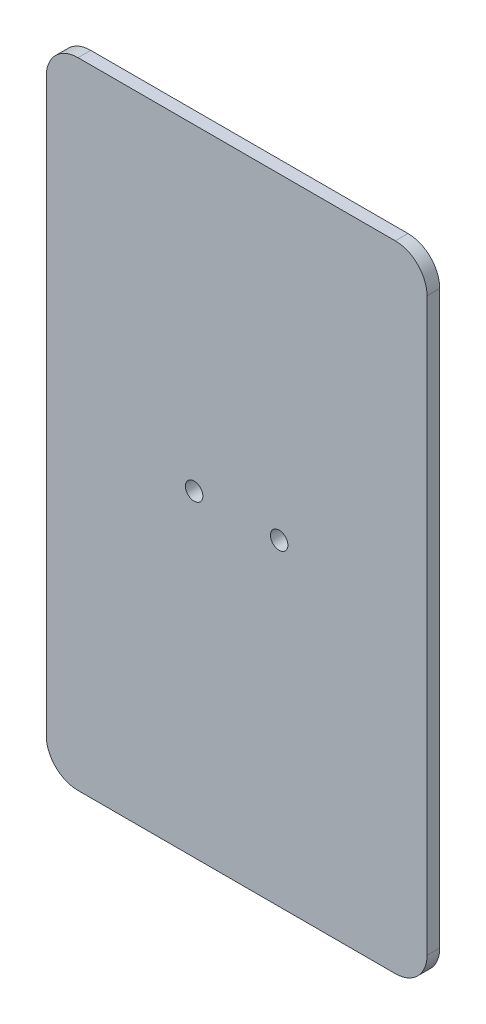
ISO-10303-21;
HEADER;
FILE_DESCRIPTION(('STEP AP214'),'2;1');
FILE_NAME('part.step','',(''),(''),'','','');
FILE_SCHEMA(('AUTOMOTIVE_DESIGN { 1 0 10303 214 1 1 1 1 }'));
ENDSEC;
DATA;
#1=APPLICATION_CONTEXT('core data for automotive mechanical design processes');
#2=APPLICATION_PROTOCOL_DEFINITION('international standard','automotive_design',2000,#1);
#3=PRODUCT_CONTEXT('',#1,'mechanical');
#4=PRODUCT('Part','Part','',(#3));
#5=PRODUCT_RELATED_PRODUCT_CATEGORY('part','',(#4));
#6=PRODUCT_DEFINITION_FORMATION('','',#4);
#7=PRODUCT_DEFINITION_CONTEXT('part definition',#1,'design');
#8=PRODUCT_DEFINITION('design','',#6,#7);
#9=PRODUCT_DEFINITION_SHAPE('','',#8);
#10=(LENGTH_UNIT() NAMED_UNIT(*) SI_UNIT(.MILLI.,.METRE.));
#11=(NAMED_UNIT(*) PLANE_ANGLE_UNIT() SI_UNIT($,.RADIAN.));
#12=(NAMED_UNIT(*) SI_UNIT($,.STERADIAN.) SOLID_ANGLE_UNIT());
#13=UNCERTAINTY_MEASURE_WITH_UNIT(LENGTH_MEASURE(1.E-05),#10,'distance_accuracy_value','');
#14=(GEOMETRIC_REPRESENTATION_CONTEXT(3) GLOBAL_UNCERTAINTY_ASSIGNED_CONTEXT((#13)) GLOBAL_UNIT_ASSIGNED_CONTEXT((#10,
#11,#12)) REPRESENTATION_CONTEXT('',''));
#15=CARTESIAN_POINT('',(0.,0.,0.));
#16=DIRECTION('',(0.,0.,1.));
#17=DIRECTION('',(1.,0.,0.));
#18=AXIS2_PLACEMENT_3D('',#15,#16,#17);
#19=CARTESIAN_POINT('',(6.35,6.35,2.54));
#20=DIRECTION('',(0.,0.,-1.));
#21=DIRECTION('',(-1.,0.,0.));
#22=AXIS2_PLACEMENT_3D('',#19,#20,#21);
#23=PLANE('',#22);
#24=CARTESIAN_POINT('',(6.35,6.35,2.54));
#25=DIRECTION('',(0.,0.,1.));
#26=DIRECTION('',(-1.,0.,0.));
#27=AXIS2_PLACEMENT_3D('',#24,#25,#26);
#28=CIRCLE('',#27,6.35);
#29=CARTESIAN_POINT('',(0.,6.35000000000004,2.54));
#30=VERTEX_POINT('',#29);
#31=CARTESIAN_POINT('',(6.35000000000004,0.,2.54));
#32=VERTEX_POINT('',#31);
#33=EDGE_CURVE('E145',#30,#32,#28,.T.);
#34=ORIENTED_EDGE('',*,*,#33,.T.);
#35=DIRECTION('',(1.,0.,0.));
#36=VECTOR('',#35,1.);
#37=CARTESIAN_POINT('',(6.35000000000004,0.,2.54));
#38=LINE('',#37,#36);
#39=CARTESIAN_POINT('',(69.85,0.,2.54));
#40=VERTEX_POINT('',#39);
#41=EDGE_CURVE('E93',#32,#40,#38,.T.);
#42=ORIENTED_EDGE('',*,*,#41,.T.);
#43=CARTESIAN_POINT('',(69.85,6.35,2.54));
#44=DIRECTION('',(0.,0.,1.));
#45=DIRECTION('',(1.,0.,0.));
#46=AXIS2_PLACEMENT_3D('',#43,#44,#45);
#47=CIRCLE('',#46,6.35);
#48=CARTESIAN_POINT('',(76.2,6.35,2.54));
#49=VERTEX_POINT('',#48);
#50=EDGE_CURVE('E160',#40,#49,#47,.T.);
#51=ORIENTED_EDGE('',*,*,#50,.T.);
#52=DIRECTION('',(0.,1.,0.));
#53=VECTOR('',#52,1.);
#54=CARTESIAN_POINT('',(76.2,6.35000000000004,2.54));
#55=LINE('',#54,#53);
#56=CARTESIAN_POINT('',(76.2,120.65,2.54));
#57=VERTEX_POINT('',#56);
#58=EDGE_CURVE('E173',#49,#57,#55,.T.);
#59=ORIENTED_EDGE('',*,*,#58,.T.);
#60=CARTESIAN_POINT('',(69.85,120.65,2.54));
#61=DIRECTION('',(0.,0.,1.));
#62=DIRECTION('',(-1.,0.,0.));
#63=AXIS2_PLACEMENT_3D('',#60,#61,#62);
#64=CIRCLE('',#63,6.34999999999999);
#65=CARTESIAN_POINT('',(69.85,127.,2.54));
#66=VERTEX_POINT('',#65);
#67=EDGE_CURVE('E112',#57,#66,#64,.T.);
#68=ORIENTED_EDGE('',*,*,#67,.T.);
#69=DIRECTION('',(-1.,0.,0.));
#70=VECTOR('',#69,1.);
#71=CARTESIAN_POINT('',(6.35000000000004,127.,2.54));
#72=LINE('',#71,#70);
#73=CARTESIAN_POINT('',(6.35000000000004,127.,2.54));
#74=VERTEX_POINT('',#73);
#75=EDGE_CURVE('E106',#66,#74,#72,.T.);
#76=ORIENTED_EDGE('',*,*,#75,.T.);
#77=CARTESIAN_POINT('',(6.35,120.65,2.54));
#78=DIRECTION('',(0.,0.,1.));
#79=DIRECTION('',(-1.,0.,0.));
#80=AXIS2_PLACEMENT_3D('',#77,#78,#79);
#81=CIRCLE('',#80,6.35);
#82=CARTESIAN_POINT('',(0.,120.65,2.54));
#83=VERTEX_POINT('',#82);
#84=EDGE_CURVE('E110',#74,#83,#81,.T.);
#85=ORIENTED_EDGE('',*,*,#84,.T.);
#86=DIRECTION('',(0.,-1.,0.));
#87=VECTOR('',#86,1.);
#88=CARTESIAN_POINT('',(0.,6.35000000000004,2.54));
#89=LINE('',#88,#87);
#90=EDGE_CURVE('E50',#83,#30,#89,.T.);
#91=ORIENTED_EDGE('',*,*,#90,.T.);
#92=EDGE_LOOP('',(#34,#42,#51,#59,#68,#76,#85,#91));
#93=FACE_BOUND('',#92,.T.);
#94=CARTESIAN_POINT('',(29.591,63.5,2.54));
#95=DIRECTION('',(0.,0.,1.));
#96=DIRECTION('',(1.,0.,0.));
#97=AXIS2_PLACEMENT_3D('',#94,#95,#96);
#98=CIRCLE('',#97,1.74624999999999);
#99=CARTESIAN_POINT('',(31.33725,63.5,2.54));
#100=VERTEX_POINT('',#99);
#101=EDGE_CURVE('E134',#100,#100,#98,.T.);
#102=ORIENTED_EDGE('',*,*,#101,.F.);
#103=EDGE_LOOP('',(#102));
#104=FACE_BOUND('',#103,.T.);
#105=CARTESIAN_POINT('',(46.609,63.5,2.54));
#106=DIRECTION('',(0.,0.,1.));
#107=DIRECTION('',(1.,0.,0.));
#108=AXIS2_PLACEMENT_3D('',#105,#106,#107);
#109=CIRCLE('',#108,1.74624999999999);
#110=CARTESIAN_POINT('',(48.35525,63.5,2.54));
#111=VERTEX_POINT('',#110);
#112=EDGE_CURVE('E182',#111,#111,#109,.T.);
#113=ORIENTED_EDGE('',*,*,#112,.F.);
#114=EDGE_LOOP('',(#113));
#115=FACE_BOUND('',#114,.T.);
#116=ADVANCED_FACE('F33',(#93,#104,#115),#23,.F.);
#117=CARTESIAN_POINT('',(6.35,6.35,0.));
#118=DIRECTION('',(0.,0.,-1.));
#119=DIRECTION('',(-1.,0.,0.));
#120=AXIS2_PLACEMENT_3D('',#117,#118,#119);
#121=PLANE('',#120);
#122=CARTESIAN_POINT('',(29.591,63.5,0.));
#123=DIRECTION('',(0.,0.,1.));
#124=DIRECTION('',(1.,0.,0.));
#125=AXIS2_PLACEMENT_3D('',#122,#123,#124);
#126=CIRCLE('',#125,1.74624999999999);
#127=CARTESIAN_POINT('',(31.33725,63.5,0.));
#128=VERTEX_POINT('',#127);
#129=EDGE_CURVE('E179',#128,#128,#126,.T.);
#130=ORIENTED_EDGE('',*,*,#129,.T.);
#131=EDGE_LOOP('',(#130));
#132=FACE_BOUND('',#131,.T.);
#133=CARTESIAN_POINT('',(6.35,6.35,0.));
#134=DIRECTION('',(0.,0.,1.));
#135=DIRECTION('',(-1.,0.,0.));
#136=AXIS2_PLACEMENT_3D('',#133,#134,#135);
#137=CIRCLE('',#136,6.35);
#138=CARTESIAN_POINT('',(0.,6.35000000000004,0.));
#139=VERTEX_POINT('',#138);
#140=CARTESIAN_POINT('',(6.35000000000004,0.,0.));
#141=VERTEX_POINT('',#140);
#142=EDGE_CURVE('E130',#139,#141,#137,.T.);
#143=ORIENTED_EDGE('',*,*,#142,.F.);
#144=DIRECTION('',(0.,-1.,0.));
#145=VECTOR('',#144,1.);
#146=CARTESIAN_POINT('',(0.,6.35000000000004,0.));
#147=LINE('',#146,#145);
#148=CARTESIAN_POINT('',(0.,120.65,0.));
#149=VERTEX_POINT('',#148);
#150=EDGE_CURVE('E85',#149,#139,#147,.T.);
#151=ORIENTED_EDGE('',*,*,#150,.F.);
#152=CARTESIAN_POINT('',(6.35,120.65,0.));
#153=DIRECTION('',(0.,0.,1.));
#154=DIRECTION('',(-1.,0.,0.));
#155=AXIS2_PLACEMENT_3D('',#152,#153,#154);
#156=CIRCLE('',#155,6.35);
#157=CARTESIAN_POINT('',(6.35000000000004,127.,0.));
#158=VERTEX_POINT('',#157);
#159=EDGE_CURVE('E79',#158,#149,#156,.T.);
#160=ORIENTED_EDGE('',*,*,#159,.F.);
#161=DIRECTION('',(-1.,0.,0.));
#162=VECTOR('',#161,1.);
#163=CARTESIAN_POINT('',(6.35000000000004,127.,0.));
#164=LINE('',#163,#162);
#165=CARTESIAN_POINT('',(69.85,127.,0.));
#166=VERTEX_POINT('',#165);
#167=EDGE_CURVE('E120',#166,#158,#164,.T.);
#168=ORIENTED_EDGE('',*,*,#167,.F.);
#169=CARTESIAN_POINT('',(69.85,120.65,0.));
#170=DIRECTION('',(0.,0.,1.));
#171=DIRECTION('',(-1.,0.,0.));
#172=AXIS2_PLACEMENT_3D('',#169,#170,#171);
#173=CIRCLE('',#172,6.34999999999999);
#174=CARTESIAN_POINT('',(76.2,120.65,0.));
#175=VERTEX_POINT('',#174);
#176=EDGE_CURVE('E140',#175,#166,#173,.T.);
#177=ORIENTED_EDGE('',*,*,#176,.F.);
#178=DIRECTION('',(0.,1.,0.));
#179=VECTOR('',#178,1.);
#180=CARTESIAN_POINT('',(76.2,6.35000000000004,0.));
#181=LINE('',#180,#179);
#182=CARTESIAN_POINT('',(76.2,6.35,0.));
#183=VERTEX_POINT('',#182);
#184=EDGE_CURVE('E138',#183,#175,#181,.T.);
#185=ORIENTED_EDGE('',*,*,#184,.F.);
#186=CARTESIAN_POINT('',(69.85,6.35,0.));
#187=DIRECTION('',(0.,0.,1.));
#188=DIRECTION('',(1.,0.,0.));
#189=AXIS2_PLACEMENT_3D('',#186,#187,#188);
#190=CIRCLE('',#189,6.35);
#191=CARTESIAN_POINT('',(69.85,0.,0.));
#192=VERTEX_POINT('',#191);
#193=EDGE_CURVE('E136',#192,#183,#190,.T.);
#194=ORIENTED_EDGE('',*,*,#193,.F.);
#195=DIRECTION('',(1.,0.,0.));
#196=VECTOR('',#195,1.);
#197=CARTESIAN_POINT('',(6.35000000000004,0.,0.));
#198=LINE('',#197,#196);
#199=EDGE_CURVE('E133',#141,#192,#198,.T.);
#200=ORIENTED_EDGE('',*,*,#199,.F.);
#201=EDGE_LOOP('',(#143,#151,#160,#168,#177,#185,#194,#200));
#202=FACE_BOUND('',#201,.T.);
#203=CARTESIAN_POINT('',(46.609,63.5,0.));
#204=DIRECTION('',(0.,0.,1.));
#205=DIRECTION('',(1.,0.,0.));
#206=AXIS2_PLACEMENT_3D('',#203,#204,#205);
#207=CIRCLE('',#206,1.74624999999999);
#208=CARTESIAN_POINT('',(48.35525,63.5,0.));
#209=VERTEX_POINT('',#208);
#210=EDGE_CURVE('E185',#209,#209,#207,.T.);
#211=ORIENTED_EDGE('',*,*,#210,.T.);
#212=EDGE_LOOP('',(#211));
#213=FACE_BOUND('',#212,.T.);
#214=ADVANCED_FACE('F164',(#132,#202,#213),#121,.T.);
#215=CARTESIAN_POINT('',(6.35,6.35,2.54));
#216=DIRECTION('',(0.,0.,-1.));
#217=DIRECTION('',(-1.,0.,0.));
#218=AXIS2_PLACEMENT_3D('',#215,#216,#217);
#219=CYLINDRICAL_SURFACE('',#218,6.35);
#220=ORIENTED_EDGE('',*,*,#142,.T.);
#221=DIRECTION('',(0.,0.,-1.));
#222=VECTOR('',#221,1.);
#223=CARTESIAN_POINT('',(6.35000000000004,0.,2.54));
#224=LINE('',#223,#222);
#225=EDGE_CURVE('E11',#32,#141,#224,.T.);
#226=ORIENTED_EDGE('',*,*,#225,.F.);
#227=ORIENTED_EDGE('',*,*,#33,.F.);
#228=DIRECTION('',(0.,0.,-1.));
#229=VECTOR('',#228,1.);
#230=CARTESIAN_POINT('',(0.,6.35000000000004,2.54));
#231=LINE('',#230,#229);
#232=EDGE_CURVE('E126',#30,#139,#231,.T.);
#233=ORIENTED_EDGE('',*,*,#232,.T.);
#234=EDGE_LOOP('',(#220,#226,#227,#233));
#235=FACE_BOUND('',#234,.T.);
#236=ADVANCED_FACE('F35',(#235),#219,.T.);
#237=CARTESIAN_POINT('',(6.35000000000004,0.,2.54));
#238=DIRECTION('',(0.,1.,0.));
#239=DIRECTION('',(0.,0.,1.));
#240=AXIS2_PLACEMENT_3D('',#237,#238,#239);
#241=PLANE('',#240);
#242=ORIENTED_EDGE('',*,*,#199,.T.);
#243=DIRECTION('',(0.,0.,-1.));
#244=VECTOR('',#243,1.);
#245=CARTESIAN_POINT('',(69.85,0.,2.54));
#246=LINE('',#245,#244);
#247=EDGE_CURVE('E42',#40,#192,#246,.T.);
#248=ORIENTED_EDGE('',*,*,#247,.F.);
#249=ORIENTED_EDGE('',*,*,#41,.F.);
#250=ORIENTED_EDGE('',*,*,#225,.T.);
#251=EDGE_LOOP('',(#242,#248,#249,#250));
#252=FACE_BOUND('',#251,.T.);
#253=ADVANCED_FACE('F217',(#252),#241,.F.);
#254=CARTESIAN_POINT('',(69.85,6.35,2.54));
#255=DIRECTION('',(0.,0.,-1.));
#256=DIRECTION('',(-1.,0.,0.));
#257=AXIS2_PLACEMENT_3D('',#254,#255,#256);
#258=CYLINDRICAL_SURFACE('',#257,6.35);
#259=ORIENTED_EDGE('',*,*,#193,.T.);
#260=DIRECTION('',(0.,0.,-1.));
#261=VECTOR('',#260,1.);
#262=CARTESIAN_POINT('',(76.2,6.35,2.54));
#263=LINE('',#262,#261);
#264=EDGE_CURVE('E152',#49,#183,#263,.T.);
#265=ORIENTED_EDGE('',*,*,#264,.F.);
#266=ORIENTED_EDGE('',*,*,#50,.F.);
#267=ORIENTED_EDGE('',*,*,#247,.T.);
#268=EDGE_LOOP('',(#259,#265,#266,#267));
#269=FACE_BOUND('',#268,.T.);
#270=ADVANCED_FACE('F158',(#269),#258,.T.);
#271=CARTESIAN_POINT('',(76.2,6.35000000000004,2.54));
#272=DIRECTION('',(-1.,0.,0.));
#273=DIRECTION('',(0.,0.,1.));
#274=AXIS2_PLACEMENT_3D('',#271,#272,#273);
#275=PLANE('',#274);
#276=ORIENTED_EDGE('',*,*,#184,.T.);
#277=DIRECTION('',(0.,0.,-1.));
#278=VECTOR('',#277,1.);
#279=CARTESIAN_POINT('',(76.2,120.65,2.54));
#280=LINE('',#279,#278);
#281=EDGE_CURVE('E149',#57,#175,#280,.T.);
#282=ORIENTED_EDGE('',*,*,#281,.F.);
#283=ORIENTED_EDGE('',*,*,#58,.F.);
#284=ORIENTED_EDGE('',*,*,#264,.T.);
#285=EDGE_LOOP('',(#276,#282,#283,#284));
#286=FACE_BOUND('',#285,.T.);
#287=ADVANCED_FACE('F169',(#286),#275,.F.);
#288=CARTESIAN_POINT('',(69.85,120.65,2.54));
#289=DIRECTION('',(0.,0.,-1.));
#290=DIRECTION('',(-1.,0.,0.));
#291=AXIS2_PLACEMENT_3D('',#288,#289,#290);
#292=CYLINDRICAL_SURFACE('',#291,6.34999999999999);
#293=ORIENTED_EDGE('',*,*,#176,.T.);
#294=DIRECTION('',(0.,0.,-1.));
#295=VECTOR('',#294,1.);
#296=CARTESIAN_POINT('',(69.85,127.,2.54));
#297=LINE('',#296,#295);
#298=EDGE_CURVE('E121',#66,#166,#297,.T.);
#299=ORIENTED_EDGE('',*,*,#298,.F.);
#300=ORIENTED_EDGE('',*,*,#67,.F.);
#301=ORIENTED_EDGE('',*,*,#281,.T.);
#302=EDGE_LOOP('',(#293,#299,#300,#301));
#303=FACE_BOUND('',#302,.T.);
#304=ADVANCED_FACE('F172',(#303),#292,.T.);
#305=CARTESIAN_POINT('',(6.35000000000004,127.,2.54));
#306=DIRECTION('',(0.,-1.,0.));
#307=DIRECTION('',(0.,0.,-1.));
#308=AXIS2_PLACEMENT_3D('',#305,#306,#307);
#309=PLANE('',#308);
#310=ORIENTED_EDGE('',*,*,#167,.T.);
#311=DIRECTION('',(0.,0.,-1.));
#312=VECTOR('',#311,1.);
#313=CARTESIAN_POINT('',(6.35000000000004,127.,2.54));
#314=LINE('',#313,#312);
#315=EDGE_CURVE('E117',#74,#158,#314,.T.);
#316=ORIENTED_EDGE('',*,*,#315,.F.);
#317=ORIENTED_EDGE('',*,*,#75,.F.);
#318=ORIENTED_EDGE('',*,*,#298,.T.);
#319=EDGE_LOOP('',(#310,#316,#317,#318));
#320=FACE_BOUND('',#319,.T.);
#321=ADVANCED_FACE('F118',(#320),#309,.F.);
#322=CARTESIAN_POINT('',(6.35,120.65,2.54));
#323=DIRECTION('',(0.,0.,-1.));
#324=DIRECTION('',(-1.,0.,0.));
#325=AXIS2_PLACEMENT_3D('',#322,#323,#324);
#326=CYLINDRICAL_SURFACE('',#325,6.35);
#327=ORIENTED_EDGE('',*,*,#159,.T.);
#328=DIRECTION('',(0.,0.,-1.));
#329=VECTOR('',#328,1.);
#330=CARTESIAN_POINT('',(0.,120.65,2.54));
#331=LINE('',#330,#329);
#332=EDGE_CURVE('E122',#83,#149,#331,.T.);
#333=ORIENTED_EDGE('',*,*,#332,.F.);
#334=ORIENTED_EDGE('',*,*,#84,.F.);
#335=ORIENTED_EDGE('',*,*,#315,.T.);
#336=EDGE_LOOP('',(#327,#333,#334,#335));
#337=FACE_BOUND('',#336,.T.);
#338=ADVANCED_FACE('F124',(#337),#326,.T.);
#339=CARTESIAN_POINT('',(0.,6.35000000000004,2.54));
#340=DIRECTION('',(1.,0.,0.));
#341=DIRECTION('',(0.,0.,-1.));
#342=AXIS2_PLACEMENT_3D('',#339,#340,#341);
#343=PLANE('',#342);
#344=ORIENTED_EDGE('',*,*,#150,.T.);
#345=ORIENTED_EDGE('',*,*,#232,.F.);
#346=ORIENTED_EDGE('',*,*,#90,.F.);
#347=ORIENTED_EDGE('',*,*,#332,.T.);
#348=EDGE_LOOP('',(#344,#345,#346,#347));
#349=FACE_BOUND('',#348,.T.);
#350=ADVANCED_FACE('F205',(#349),#343,.F.);
#351=CARTESIAN_POINT('',(29.591,63.5,2.54));
#352=DIRECTION('',(0.,0.,-1.));
#353=DIRECTION('',(-1.,0.,0.));
#354=AXIS2_PLACEMENT_3D('',#351,#352,#353);
#355=CYLINDRICAL_SURFACE('',#354,1.74624999999999);
#356=ORIENTED_EDGE('',*,*,#101,.T.);
#357=EDGE_LOOP('',(#356));
#358=FACE_BOUND('',#357,.T.);
#359=ORIENTED_EDGE('',*,*,#129,.F.);
#360=EDGE_LOOP('',(#359));
#361=FACE_BOUND('',#360,.T.);
#362=ADVANCED_FACE('F202',(#358,#361),#355,.F.);
#363=CARTESIAN_POINT('',(46.609,63.5,2.54));
#364=DIRECTION('',(0.,0.,-1.));
#365=DIRECTION('',(-1.,0.,0.));
#366=AXIS2_PLACEMENT_3D('',#363,#364,#365);
#367=CYLINDRICAL_SURFACE('',#366,1.74624999999999);
#368=ORIENTED_EDGE('',*,*,#112,.T.);
#369=EDGE_LOOP('',(#368));
#370=FACE_BOUND('',#369,.T.);
#371=ORIENTED_EDGE('',*,*,#210,.F.);
#372=EDGE_LOOP('',(#371));
#373=FACE_BOUND('',#372,.T.);
#374=ADVANCED_FACE('F191',(#370,#373),#367,.F.);
#375=CLOSED_SHELL('',(#116,#214,#236,#253,#270,#287,#304,#321,#338,#350,#362,#374));
#376=MANIFOLD_SOLID_BREP('B2',#375);
#377=ADVANCED_BREP_SHAPE_REPRESENTATION('',(#18,#376),#14);
#378=SHAPE_DEFINITION_REPRESENTATION(#9,#377);
ENDSEC;
END-ISO-10303-21;
